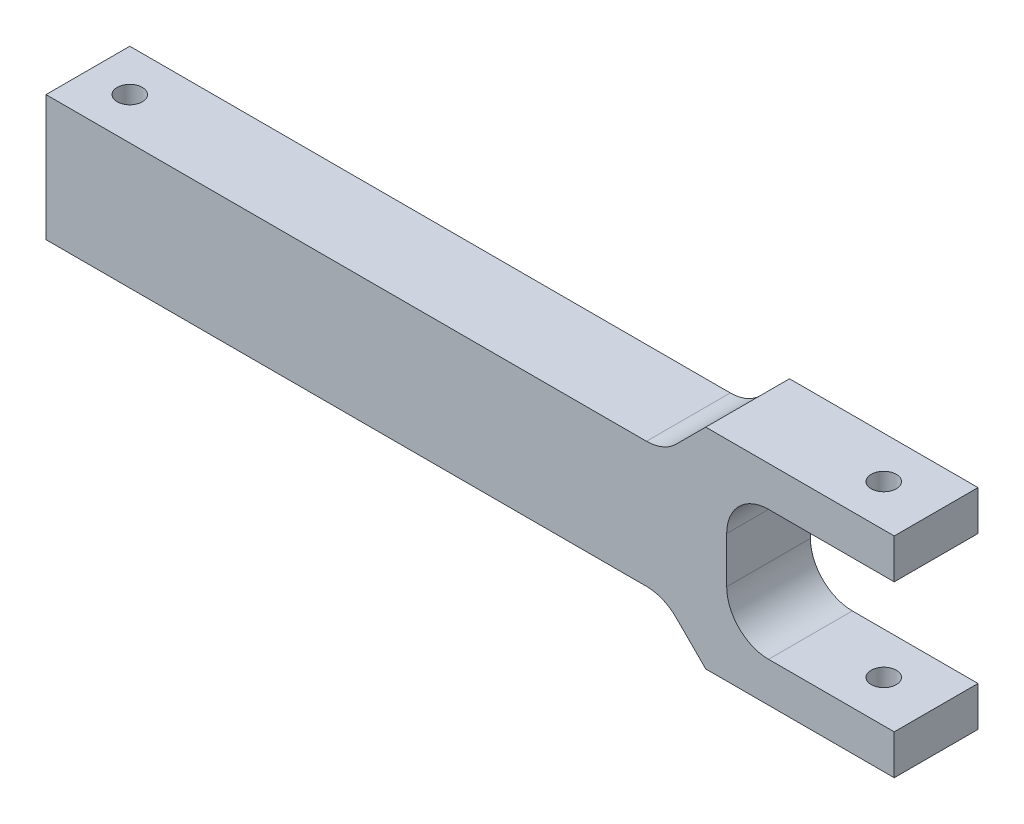
ISO-10303-21;
HEADER;
FILE_DESCRIPTION(('STEP AP214'),'2;1');
FILE_NAME('part.step','',(''),(''),'','','');
FILE_SCHEMA(('AUTOMOTIVE_DESIGN { 1 0 10303 214 1 1 1 1 }'));
ENDSEC;
DATA;
#1=APPLICATION_CONTEXT('core data for automotive mechanical design processes');
#2=APPLICATION_PROTOCOL_DEFINITION('international standard','automotive_design',2000,#1);
#3=PRODUCT_CONTEXT('',#1,'mechanical');
#4=PRODUCT('Part','Part','',(#3));
#5=PRODUCT_RELATED_PRODUCT_CATEGORY('part','',(#4));
#6=PRODUCT_DEFINITION_FORMATION('','',#4);
#7=PRODUCT_DEFINITION_CONTEXT('part definition',#1,'design');
#8=PRODUCT_DEFINITION('design','',#6,#7);
#9=PRODUCT_DEFINITION_SHAPE('','',#8);
#10=(LENGTH_UNIT() NAMED_UNIT(*) SI_UNIT(.MILLI.,.METRE.));
#11=(NAMED_UNIT(*) PLANE_ANGLE_UNIT() SI_UNIT($,.RADIAN.));
#12=(NAMED_UNIT(*) SI_UNIT($,.STERADIAN.) SOLID_ANGLE_UNIT());
#13=UNCERTAINTY_MEASURE_WITH_UNIT(LENGTH_MEASURE(1.E-05),#10,'distance_accuracy_value','');
#14=(GEOMETRIC_REPRESENTATION_CONTEXT(3) GLOBAL_UNCERTAINTY_ASSIGNED_CONTEXT((#13)) GLOBAL_UNIT_ASSIGNED_CONTEXT((#10,
#11,#12)) REPRESENTATION_CONTEXT('',''));
#15=CARTESIAN_POINT('',(0.,0.,0.));
#16=DIRECTION('',(0.,0.,1.));
#17=DIRECTION('',(1.,0.,0.));
#18=AXIS2_PLACEMENT_3D('',#15,#16,#17);
#19=CARTESIAN_POINT('',(101.25,50.,-10.));
#20=DIRECTION('',(-1.,0.,0.));
#21=DIRECTION('',(0.,0.,1.));
#22=AXIS2_PLACEMENT_3D('',#19,#20,#21);
#23=PLANE('',#22);
#24=DIRECTION('',(0.,-1.,0.));
#25=VECTOR('',#24,1.);
#26=CARTESIAN_POINT('',(101.25,50.,-10.));
#27=LINE('',#26,#25);
#28=CARTESIAN_POINT('',(101.25,9.5,-10.));
#29=VERTEX_POINT('',#28);
#30=CARTESIAN_POINT('',(101.25,0.,-10.));
#31=VERTEX_POINT('',#30);
#32=EDGE_CURVE('E182',#29,#31,#27,.T.);
#33=ORIENTED_EDGE('',*,*,#32,.F.);
#34=DIRECTION('',(0.,0.,1.));
#35=VECTOR('',#34,1.);
#36=CARTESIAN_POINT('',(101.25,9.5,-10.));
#37=LINE('',#36,#35);
#38=CARTESIAN_POINT('',(101.25,9.5,10.));
#39=VERTEX_POINT('',#38);
#40=EDGE_CURVE('E207',#29,#39,#37,.T.);
#41=ORIENTED_EDGE('',*,*,#40,.T.);
#42=DIRECTION('',(0.,-1.,0.));
#43=VECTOR('',#42,1.);
#44=CARTESIAN_POINT('',(101.25,50.,10.));
#45=LINE('',#44,#43);
#46=CARTESIAN_POINT('',(101.25,0.,10.));
#47=VERTEX_POINT('',#46);
#48=EDGE_CURVE('E185',#39,#47,#45,.T.);
#49=ORIENTED_EDGE('',*,*,#48,.T.);
#50=DIRECTION('',(0.,0.,-1.));
#51=VECTOR('',#50,1.);
#52=CARTESIAN_POINT('',(101.25,0.,-10.));
#53=LINE('',#52,#51);
#54=EDGE_CURVE('E293',#47,#31,#53,.T.);
#55=ORIENTED_EDGE('',*,*,#54,.T.);
#56=EDGE_LOOP('',(#33,#41,#49,#55));
#57=FACE_BOUND('',#56,.T.);
#58=ADVANCED_FACE('F46',(#57),#23,.F.);
#59=CARTESIAN_POINT('',(88.75,50.,0.));
#60=DIRECTION('',(0.,-1.,0.));
#61=DIRECTION('',(0.,0.,-1.));
#62=AXIS2_PLACEMENT_3D('',#59,#60,#61);
#63=CYLINDRICAL_SURFACE('',#62,3.00000000000001);
#64=CARTESIAN_POINT('',(88.75,9.5,0.));
#65=DIRECTION('',(0.,-1.,0.));
#66=DIRECTION('',(0.,0.,-1.));
#67=AXIS2_PLACEMENT_3D('',#64,#65,#66);
#68=CIRCLE('',#67,3.00000000000001);
#69=CARTESIAN_POINT('',(88.75,9.5,-3.00000000000001));
#70=VERTEX_POINT('',#69);
#71=EDGE_CURVE('E198',#70,#70,#68,.T.);
#72=ORIENTED_EDGE('',*,*,#71,.F.);
#73=EDGE_LOOP('',(#72));
#74=FACE_BOUND('',#73,.T.);
#75=CARTESIAN_POINT('',(88.75,0.,0.));
#76=DIRECTION('',(0.,1.,0.));
#77=DIRECTION('',(0.,0.,1.));
#78=AXIS2_PLACEMENT_3D('',#75,#76,#77);
#79=CIRCLE('',#78,3.00000000000001);
#80=CARTESIAN_POINT('',(88.75,0.,3.00000000000001));
#81=VERTEX_POINT('',#80);
#82=EDGE_CURVE('E289',#81,#81,#79,.T.);
#83=ORIENTED_EDGE('',*,*,#82,.F.);
#84=EDGE_LOOP('',(#83));
#85=FACE_BOUND('',#84,.T.);
#86=ADVANCED_FACE('F329',(#74,#85),#63,.F.);
#87=CARTESIAN_POINT('',(0.,50.,0.));
#88=DIRECTION('',(0.,1.,0.));
#89=DIRECTION('',(0.,0.,1.));
#90=AXIS2_PLACEMENT_3D('',#87,#88,#89);
#91=PLANE('',#90);
#92=DIRECTION('',(-1.,0.,0.));
#93=VECTOR('',#92,1.);
#94=CARTESIAN_POINT('',(-101.25,50.,-10.));
#95=LINE('',#94,#93);
#96=CARTESIAN_POINT('',(101.25,50.,-10.));
#97=VERTEX_POINT('',#96);
#98=CARTESIAN_POINT('',(56.25,50.,-10.));
#99=VERTEX_POINT('',#98);
#100=EDGE_CURVE('E299',#97,#99,#95,.T.);
#101=ORIENTED_EDGE('',*,*,#100,.T.);
#102=DIRECTION('',(0.,0.,1.));
#103=VECTOR('',#102,1.);
#104=CARTESIAN_POINT('',(56.25,50.,10.));
#105=LINE('',#104,#103);
#106=CARTESIAN_POINT('',(56.25,50.,10.));
#107=VERTEX_POINT('',#106);
#108=EDGE_CURVE('E222',#99,#107,#105,.T.);
#109=ORIENTED_EDGE('',*,*,#108,.T.);
#110=DIRECTION('',(1.,0.,0.));
#111=VECTOR('',#110,1.);
#112=CARTESIAN_POINT('',(-101.25,50.,10.));
#113=LINE('',#112,#111);
#114=CARTESIAN_POINT('',(101.25,50.,10.));
#115=VERTEX_POINT('',#114);
#116=EDGE_CURVE('E302',#107,#115,#113,.T.);
#117=ORIENTED_EDGE('',*,*,#116,.T.);
#118=DIRECTION('',(0.,0.,-1.));
#119=VECTOR('',#118,1.);
#120=CARTESIAN_POINT('',(101.25,50.,-10.));
#121=LINE('',#120,#119);
#122=EDGE_CURVE('E296',#115,#97,#121,.T.);
#123=ORIENTED_EDGE('',*,*,#122,.T.);
#124=EDGE_LOOP('',(#101,#109,#117,#123));
#125=FACE_BOUND('',#124,.T.);
#126=CARTESIAN_POINT('',(88.75,50.,0.));
#127=DIRECTION('',(0.,1.,0.));
#128=DIRECTION('',(0.,0.,1.));
#129=AXIS2_PLACEMENT_3D('',#126,#127,#128);
#130=CIRCLE('',#129,3.00000000000001);
#131=CARTESIAN_POINT('',(88.75,50.,3.00000000000001));
#132=VERTEX_POINT('',#131);
#133=EDGE_CURVE('E290',#132,#132,#130,.T.);
#134=ORIENTED_EDGE('',*,*,#133,.F.);
#135=EDGE_LOOP('',(#134));
#136=FACE_BOUND('',#135,.T.);
#137=ADVANCED_FACE('F335',(#125,#136),#91,.T.);
#138=CARTESIAN_POINT('',(0.,0.,0.));
#139=DIRECTION('',(0.,1.,0.));
#140=DIRECTION('',(0.,0.,1.));
#141=AXIS2_PLACEMENT_3D('',#138,#139,#140);
#142=PLANE('',#141);
#143=DIRECTION('',(1.,0.,0.));
#144=VECTOR('',#143,1.);
#145=CARTESIAN_POINT('',(-101.25,0.,10.));
#146=LINE('',#145,#144);
#147=CARTESIAN_POINT('',(56.25,0.,10.));
#148=VERTEX_POINT('',#147);
#149=EDGE_CURVE('E300',#148,#47,#146,.T.);
#150=ORIENTED_EDGE('',*,*,#149,.F.);
#151=DIRECTION('',(0.,0.,-1.));
#152=VECTOR('',#151,1.);
#153=CARTESIAN_POINT('',(56.25,0.,0.));
#154=LINE('',#153,#152);
#155=CARTESIAN_POINT('',(56.25,0.,-10.));
#156=VERTEX_POINT('',#155);
#157=EDGE_CURVE('E216',#148,#156,#154,.T.);
#158=ORIENTED_EDGE('',*,*,#157,.T.);
#159=DIRECTION('',(-1.,0.,0.));
#160=VECTOR('',#159,1.);
#161=CARTESIAN_POINT('',(-101.25,0.,-10.));
#162=LINE('',#161,#160);
#163=EDGE_CURVE('E306',#31,#156,#162,.T.);
#164=ORIENTED_EDGE('',*,*,#163,.F.);
#165=ORIENTED_EDGE('',*,*,#54,.F.);
#166=EDGE_LOOP('',(#150,#158,#164,#165));
#167=FACE_BOUND('',#166,.T.);
#168=ORIENTED_EDGE('',*,*,#82,.T.);
#169=EDGE_LOOP('',(#168));
#170=FACE_BOUND('',#169,.T.);
#171=ADVANCED_FACE('F318',(#167,#170),#142,.F.);
#172=CARTESIAN_POINT('',(101.25,40.5,10.));
#173=VERTEX_POINT('',#172);
#174=EDGE_CURVE('E180',#115,#173,#45,.T.);
#175=ORIENTED_EDGE('',*,*,#174,.T.);
#176=DIRECTION('',(0.,0.,-1.));
#177=VECTOR('',#176,1.);
#178=CARTESIAN_POINT('',(101.25,40.5,-10.));
#179=LINE('',#178,#177);
#180=CARTESIAN_POINT('',(101.25,40.5,-10.));
#181=VERTEX_POINT('',#180);
#182=EDGE_CURVE('E202',#173,#181,#179,.T.);
#183=ORIENTED_EDGE('',*,*,#182,.T.);
#184=EDGE_CURVE('E189',#97,#181,#27,.T.);
#185=ORIENTED_EDGE('',*,*,#184,.F.);
#186=ORIENTED_EDGE('',*,*,#122,.F.);
#187=EDGE_LOOP('',(#175,#183,#185,#186));
#188=FACE_BOUND('',#187,.T.);
#189=ADVANCED_FACE('F331',(#188),#23,.F.);
#190=CARTESIAN_POINT('',(-101.25,50.,-10.));
#191=DIRECTION('',(0.,0.,1.));
#192=DIRECTION('',(1.,0.,0.));
#193=AXIS2_PLACEMENT_3D('',#190,#191,#192);
#194=PLANE('',#193);
#195=ORIENTED_EDGE('',*,*,#163,.T.);
#196=DIRECTION('',(0.70710678118655,-0.707106781186546,0.));
#197=VECTOR('',#196,1.);
#198=CARTESIAN_POINT('',(46.25,9.99999999999998,-10.));
#199=LINE('',#198,#197);
#200=CARTESIAN_POINT('',(49.1789321881346,7.07106781186541,-10.));
#201=VERTEX_POINT('',#200);
#202=EDGE_CURVE('E220',#156,#201,#199,.F.);
#203=ORIENTED_EDGE('',*,*,#202,.T.);
#204=CARTESIAN_POINT('',(42.1078643762691,0.,-10.));
#205=DIRECTION('',(0.,0.,1.));
#206=DIRECTION('',(1.,0.,0.));
#207=AXIS2_PLACEMENT_3D('',#204,#205,#206);
#208=CIRCLE('',#207,10.);
#209=CARTESIAN_POINT('',(42.1078643762691,9.99999999999992,-10.));
#210=VERTEX_POINT('',#209);
#211=EDGE_CURVE('E13',#201,#210,#208,.T.);
#212=ORIENTED_EDGE('',*,*,#211,.T.);
#213=DIRECTION('',(-1.,0.,0.));
#214=VECTOR('',#213,1.);
#215=CARTESIAN_POINT('',(-101.25,10.,-10.));
#216=LINE('',#215,#214);
#217=CARTESIAN_POINT('',(-101.25,10.,-10.));
#218=VERTEX_POINT('',#217);
#219=EDGE_CURVE('E206',#210,#218,#216,.T.);
#220=ORIENTED_EDGE('',*,*,#219,.T.);
#221=DIRECTION('',(0.,-1.,0.));
#222=VECTOR('',#221,1.);
#223=CARTESIAN_POINT('',(-101.25,50.,-10.));
#224=LINE('',#223,#222);
#225=CARTESIAN_POINT('',(-101.25,40.,-10.));
#226=VERTEX_POINT('',#225);
#227=EDGE_CURVE('E174',#226,#218,#224,.T.);
#228=ORIENTED_EDGE('',*,*,#227,.F.);
#229=DIRECTION('',(1.,0.,0.));
#230=VECTOR('',#229,1.);
#231=CARTESIAN_POINT('',(-101.25,40.,-10.));
#232=LINE('',#231,#230);
#233=CARTESIAN_POINT('',(42.1078643762691,40.0000000000001,-10.));
#234=VERTEX_POINT('',#233);
#235=EDGE_CURVE('E211',#226,#234,#232,.T.);
#236=ORIENTED_EDGE('',*,*,#235,.T.);
#237=CARTESIAN_POINT('',(42.1078643762691,50.0000000000001,-10.));
#238=DIRECTION('',(0.,0.,1.));
#239=DIRECTION('',(1.,0.,0.));
#240=AXIS2_PLACEMENT_3D('',#237,#238,#239);
#241=CIRCLE('',#240,10.);
#242=CARTESIAN_POINT('',(49.1789321881346,42.9289321881346,-10.));
#243=VERTEX_POINT('',#242);
#244=EDGE_CURVE('E252',#234,#243,#241,.T.);
#245=ORIENTED_EDGE('',*,*,#244,.T.);
#246=DIRECTION('',(0.707106781186546,0.70710678118655,0.));
#247=VECTOR('',#246,1.);
#248=CARTESIAN_POINT('',(56.25,50.,-10.));
#249=LINE('',#248,#247);
#250=EDGE_CURVE('E218',#243,#99,#249,.T.);
#251=ORIENTED_EDGE('',*,*,#250,.T.);
#252=ORIENTED_EDGE('',*,*,#100,.F.);
#253=ORIENTED_EDGE('',*,*,#184,.T.);
#254=DIRECTION('',(-1.,0.,0.));
#255=VECTOR('',#254,1.);
#256=CARTESIAN_POINT('',(-101.25,40.5,-10.));
#257=LINE('',#256,#255);
#258=CARTESIAN_POINT('',(71.25,40.5,-10.));
#259=VERTEX_POINT('',#258);
#260=EDGE_CURVE('E196',#181,#259,#257,.T.);
#261=ORIENTED_EDGE('',*,*,#260,.T.);
#262=CARTESIAN_POINT('',(71.25,30.5,-10.));
#263=DIRECTION('',(0.,0.,1.));
#264=DIRECTION('',(1.,0.,0.));
#265=AXIS2_PLACEMENT_3D('',#262,#263,#264);
#266=CIRCLE('',#265,10.);
#267=CARTESIAN_POINT('',(61.25,30.5,-10.));
#268=VERTEX_POINT('',#267);
#269=EDGE_CURVE('E237',#259,#268,#266,.T.);
#270=ORIENTED_EDGE('',*,*,#269,.T.);
#271=DIRECTION('',(0.,-1.,0.));
#272=VECTOR('',#271,1.);
#273=CARTESIAN_POINT('',(61.25,50.,-10.));
#274=LINE('',#273,#272);
#275=CARTESIAN_POINT('',(61.25,19.5,-10.));
#276=VERTEX_POINT('',#275);
#277=EDGE_CURVE('E286',#268,#276,#274,.T.);
#278=ORIENTED_EDGE('',*,*,#277,.T.);
#279=CARTESIAN_POINT('',(71.25,19.5,-10.));
#280=DIRECTION('',(0.,0.,1.));
#281=DIRECTION('',(1.,0.,0.));
#282=AXIS2_PLACEMENT_3D('',#279,#280,#281);
#283=CIRCLE('',#282,10.);
#284=CARTESIAN_POINT('',(71.25,9.5,-10.));
#285=VERTEX_POINT('',#284);
#286=EDGE_CURVE('E241',#276,#285,#283,.T.);
#287=ORIENTED_EDGE('',*,*,#286,.T.);
#288=DIRECTION('',(1.,0.,0.));
#289=VECTOR('',#288,1.);
#290=CARTESIAN_POINT('',(-101.25,9.5,-10.));
#291=LINE('',#290,#289);
#292=EDGE_CURVE('E201',#285,#29,#291,.T.);
#293=ORIENTED_EDGE('',*,*,#292,.T.);
#294=ORIENTED_EDGE('',*,*,#32,.T.);
#295=EDGE_LOOP('',(#195,#203,#212,#220,#228,#236,#245,#251,#252,#253,#261,#270,#278,#287,#293,#294));
#296=FACE_BOUND('',#295,.T.);
#297=ADVANCED_FACE('F258',(#296),#194,.F.);
#298=CARTESIAN_POINT('',(-101.25,50.,-10.));
#299=DIRECTION('',(1.,0.,0.));
#300=DIRECTION('',(0.,0.,-1.));
#301=AXIS2_PLACEMENT_3D('',#298,#299,#300);
#302=PLANE('',#301);
#303=DIRECTION('',(0.,-1.,0.));
#304=VECTOR('',#303,1.);
#305=CARTESIAN_POINT('',(-101.25,50.,10.));
#306=LINE('',#305,#304);
#307=CARTESIAN_POINT('',(-101.25,40.,10.));
#308=VERTEX_POINT('',#307);
#309=CARTESIAN_POINT('',(-101.25,10.,10.));
#310=VERTEX_POINT('',#309);
#311=EDGE_CURVE('E172',#308,#310,#306,.T.);
#312=ORIENTED_EDGE('',*,*,#311,.F.);
#313=DIRECTION('',(0.,0.,1.));
#314=VECTOR('',#313,1.);
#315=CARTESIAN_POINT('',(-101.25,40.,-15.));
#316=LINE('',#315,#314);
#317=EDGE_CURVE('E270',#226,#308,#316,.T.);
#318=ORIENTED_EDGE('',*,*,#317,.F.);
#319=ORIENTED_EDGE('',*,*,#227,.T.);
#320=DIRECTION('',(0.,0.,1.));
#321=VECTOR('',#320,1.);
#322=CARTESIAN_POINT('',(-101.25,10.,-15.));
#323=LINE('',#322,#321);
#324=EDGE_CURVE('E162',#218,#310,#323,.T.);
#325=ORIENTED_EDGE('',*,*,#324,.T.);
#326=EDGE_LOOP('',(#312,#318,#319,#325));
#327=FACE_BOUND('',#326,.T.);
#328=ADVANCED_FACE('F170',(#327),#302,.F.);
#329=CARTESIAN_POINT('',(-101.25,50.,10.));
#330=DIRECTION('',(0.,0.,-1.));
#331=DIRECTION('',(-1.,0.,0.));
#332=AXIS2_PLACEMENT_3D('',#329,#330,#331);
#333=PLANE('',#332);
#334=DIRECTION('',(-1.,0.,0.));
#335=VECTOR('',#334,1.);
#336=CARTESIAN_POINT('',(-101.25,10.,10.));
#337=LINE('',#336,#335);
#338=CARTESIAN_POINT('',(42.1078643762691,9.99999999999992,10.));
#339=VERTEX_POINT('',#338);
#340=EDGE_CURVE('E158',#339,#310,#337,.T.);
#341=ORIENTED_EDGE('',*,*,#340,.F.);
#342=CARTESIAN_POINT('',(42.1078643762691,0.,10.));
#343=DIRECTION('',(0.,0.,-1.));
#344=DIRECTION('',(-1.,0.,0.));
#345=AXIS2_PLACEMENT_3D('',#342,#343,#344);
#346=CIRCLE('',#345,10.);
#347=CARTESIAN_POINT('',(49.1789321881346,7.07106781186541,10.));
#348=VERTEX_POINT('',#347);
#349=EDGE_CURVE('E54',#339,#348,#346,.T.);
#350=ORIENTED_EDGE('',*,*,#349,.T.);
#351=DIRECTION('',(-0.70710678118655,0.707106781186546,0.));
#352=VECTOR('',#351,1.);
#353=CARTESIAN_POINT('',(46.25,9.99999999999998,10.));
#354=LINE('',#353,#352);
#355=EDGE_CURVE('E214',#348,#148,#354,.F.);
#356=ORIENTED_EDGE('',*,*,#355,.T.);
#357=ORIENTED_EDGE('',*,*,#149,.T.);
#358=ORIENTED_EDGE('',*,*,#48,.F.);
#359=DIRECTION('',(1.,0.,0.));
#360=VECTOR('',#359,1.);
#361=CARTESIAN_POINT('',(61.25,9.5,10.));
#362=LINE('',#361,#360);
#363=CARTESIAN_POINT('',(71.25,9.5,10.));
#364=VERTEX_POINT('',#363);
#365=EDGE_CURVE('E197',#364,#39,#362,.T.);
#366=ORIENTED_EDGE('',*,*,#365,.F.);
#367=CARTESIAN_POINT('',(71.25,19.5,10.));
#368=DIRECTION('',(0.,0.,-1.));
#369=DIRECTION('',(-1.,0.,0.));
#370=AXIS2_PLACEMENT_3D('',#367,#368,#369);
#371=CIRCLE('',#370,10.);
#372=CARTESIAN_POINT('',(61.25,19.5,10.));
#373=VERTEX_POINT('',#372);
#374=EDGE_CURVE('E239',#364,#373,#371,.T.);
#375=ORIENTED_EDGE('',*,*,#374,.T.);
#376=DIRECTION('',(0.,-1.,0.));
#377=VECTOR('',#376,1.);
#378=CARTESIAN_POINT('',(61.25,40.5,10.));
#379=LINE('',#378,#377);
#380=CARTESIAN_POINT('',(61.25,30.5,10.));
#381=VERTEX_POINT('',#380);
#382=EDGE_CURVE('E356',#381,#373,#379,.T.);
#383=ORIENTED_EDGE('',*,*,#382,.F.);
#384=CARTESIAN_POINT('',(71.25,30.5,10.));
#385=DIRECTION('',(0.,0.,-1.));
#386=DIRECTION('',(-1.,0.,0.));
#387=AXIS2_PLACEMENT_3D('',#384,#385,#386);
#388=CIRCLE('',#387,10.);
#389=CARTESIAN_POINT('',(71.25,40.5,10.));
#390=VERTEX_POINT('',#389);
#391=EDGE_CURVE('E235',#381,#390,#388,.T.);
#392=ORIENTED_EDGE('',*,*,#391,.T.);
#393=DIRECTION('',(-1.,0.,0.));
#394=VECTOR('',#393,1.);
#395=CARTESIAN_POINT('',(61.25,40.5,10.));
#396=LINE('',#395,#394);
#397=EDGE_CURVE('E272',#173,#390,#396,.T.);
#398=ORIENTED_EDGE('',*,*,#397,.F.);
#399=ORIENTED_EDGE('',*,*,#174,.F.);
#400=ORIENTED_EDGE('',*,*,#116,.F.);
#401=DIRECTION('',(-0.707106781186546,-0.70710678118655,0.));
#402=VECTOR('',#401,1.);
#403=CARTESIAN_POINT('',(56.25,50.,10.));
#404=LINE('',#403,#402);
#405=CARTESIAN_POINT('',(49.1789321881346,42.9289321881346,10.));
#406=VERTEX_POINT('',#405);
#407=EDGE_CURVE('E192',#107,#406,#404,.T.);
#408=ORIENTED_EDGE('',*,*,#407,.T.);
#409=CARTESIAN_POINT('',(42.1078643762691,50.0000000000001,10.));
#410=DIRECTION('',(0.,0.,-1.));
#411=DIRECTION('',(-1.,0.,0.));
#412=AXIS2_PLACEMENT_3D('',#409,#410,#411);
#413=CIRCLE('',#412,10.);
#414=CARTESIAN_POINT('',(42.1078643762691,40.0000000000001,10.));
#415=VERTEX_POINT('',#414);
#416=EDGE_CURVE('E250',#406,#415,#413,.T.);
#417=ORIENTED_EDGE('',*,*,#416,.T.);
#418=DIRECTION('',(1.,0.,0.));
#419=VECTOR('',#418,1.);
#420=CARTESIAN_POINT('',(-101.25,40.,10.));
#421=LINE('',#420,#419);
#422=EDGE_CURVE('E175',#308,#415,#421,.T.);
#423=ORIENTED_EDGE('',*,*,#422,.F.);
#424=ORIENTED_EDGE('',*,*,#311,.T.);
#425=EDGE_LOOP('',(#341,#350,#356,#357,#358,#366,#375,#383,#392,#398,#399,#400,#408,#417,#423,#424));
#426=FACE_BOUND('',#425,.T.);
#427=ADVANCED_FACE('F178',(#426),#333,.F.);
#428=CARTESIAN_POINT('',(88.75,40.5,0.));
#429=DIRECTION('',(0.,1.,0.));
#430=DIRECTION('',(0.,0.,1.));
#431=AXIS2_PLACEMENT_3D('',#428,#429,#430);
#432=CIRCLE('',#431,3.00000000000001);
#433=CARTESIAN_POINT('',(88.75,40.5,3.00000000000001));
#434=VERTEX_POINT('',#433);
#435=EDGE_CURVE('E193',#434,#434,#432,.T.);
#436=ORIENTED_EDGE('',*,*,#435,.F.);
#437=EDGE_LOOP('',(#436));
#438=FACE_BOUND('',#437,.T.);
#439=ORIENTED_EDGE('',*,*,#133,.T.);
#440=EDGE_LOOP('',(#439));
#441=FACE_BOUND('',#440,.T.);
#442=ADVANCED_FACE('F338',(#438,#441),#63,.F.);
#443=CARTESIAN_POINT('',(61.25,40.5,-15.));
#444=DIRECTION('',(-1.,0.,0.));
#445=DIRECTION('',(0.,0.,1.));
#446=AXIS2_PLACEMENT_3D('',#443,#444,#445);
#447=PLANE('',#446);
#448=ORIENTED_EDGE('',*,*,#277,.F.);
#449=DIRECTION('',(0.,0.,1.));
#450=VECTOR('',#449,1.);
#451=CARTESIAN_POINT('',(61.25,30.5,10.));
#452=LINE('',#451,#450);
#453=EDGE_CURVE('E227',#268,#381,#452,.T.);
#454=ORIENTED_EDGE('',*,*,#453,.T.);
#455=ORIENTED_EDGE('',*,*,#382,.T.);
#456=DIRECTION('',(0.,0.,1.));
#457=VECTOR('',#456,1.);
#458=CARTESIAN_POINT('',(61.25,19.5,-10.));
#459=LINE('',#458,#457);
#460=EDGE_CURVE('E225',#373,#276,#459,.F.);
#461=ORIENTED_EDGE('',*,*,#460,.T.);
#462=EDGE_LOOP('',(#448,#454,#455,#461));
#463=FACE_BOUND('',#462,.T.);
#464=ADVANCED_FACE('F368',(#463),#447,.F.);
#465=CARTESIAN_POINT('',(61.25,9.5,-15.));
#466=DIRECTION('',(0.,-1.,0.));
#467=DIRECTION('',(0.,0.,-1.));
#468=AXIS2_PLACEMENT_3D('',#465,#466,#467);
#469=PLANE('',#468);
#470=ORIENTED_EDGE('',*,*,#71,.T.);
#471=EDGE_LOOP('',(#470));
#472=FACE_BOUND('',#471,.T.);
#473=ORIENTED_EDGE('',*,*,#292,.F.);
#474=DIRECTION('',(0.,0.,1.));
#475=VECTOR('',#474,1.);
#476=CARTESIAN_POINT('',(71.25,9.5,10.));
#477=LINE('',#476,#475);
#478=EDGE_CURVE('E232',#285,#364,#477,.T.);
#479=ORIENTED_EDGE('',*,*,#478,.T.);
#480=ORIENTED_EDGE('',*,*,#365,.T.);
#481=ORIENTED_EDGE('',*,*,#40,.F.);
#482=EDGE_LOOP('',(#473,#479,#480,#481));
#483=FACE_BOUND('',#482,.T.);
#484=ADVANCED_FACE('F363',(#472,#483),#469,.F.);
#485=CARTESIAN_POINT('',(61.25,40.5,-15.));
#486=DIRECTION('',(0.,1.,0.));
#487=DIRECTION('',(0.,0.,1.));
#488=AXIS2_PLACEMENT_3D('',#485,#486,#487);
#489=PLANE('',#488);
#490=ORIENTED_EDGE('',*,*,#435,.T.);
#491=EDGE_LOOP('',(#490));
#492=FACE_BOUND('',#491,.T.);
#493=ORIENTED_EDGE('',*,*,#397,.T.);
#494=DIRECTION('',(0.,0.,1.));
#495=VECTOR('',#494,1.);
#496=CARTESIAN_POINT('',(71.25,40.5,-10.));
#497=LINE('',#496,#495);
#498=EDGE_CURVE('E230',#390,#259,#497,.F.);
#499=ORIENTED_EDGE('',*,*,#498,.T.);
#500=ORIENTED_EDGE('',*,*,#260,.F.);
#501=ORIENTED_EDGE('',*,*,#182,.F.);
#502=EDGE_LOOP('',(#493,#499,#500,#501));
#503=FACE_BOUND('',#502,.T.);
#504=ADVANCED_FACE('F373',(#492,#503),#489,.F.);
#505=CARTESIAN_POINT('',(-101.25,10.,-15.));
#506=DIRECTION('',(0.,1.,0.));
#507=DIRECTION('',(-1.,0.,0.));
#508=AXIS2_PLACEMENT_3D('',#505,#506,#507);
#509=PLANE('',#508);
#510=CARTESIAN_POINT('',(-91.25,10.,0.));
#511=DIRECTION('',(0.,1.,0.));
#512=DIRECTION('',(-1.,0.,0.));
#513=AXIS2_PLACEMENT_3D('',#510,#511,#512);
#514=CIRCLE('',#513,3.00000000000001);
#515=CARTESIAN_POINT('',(-94.25,10.,0.));
#516=VERTEX_POINT('',#515);
#517=EDGE_CURVE('E203',#516,#516,#514,.T.);
#518=ORIENTED_EDGE('',*,*,#517,.T.);
#519=EDGE_LOOP('',(#518));
#520=FACE_BOUND('',#519,.T.);
#521=ORIENTED_EDGE('',*,*,#219,.F.);
#522=DIRECTION('',(0.,0.,-1.));
#523=VECTOR('',#522,1.);
#524=CARTESIAN_POINT('',(42.1078643762691,9.99999999999992,-15.));
#525=LINE('',#524,#523);
#526=EDGE_CURVE('E165',#210,#339,#525,.F.);
#527=ORIENTED_EDGE('',*,*,#526,.T.);
#528=ORIENTED_EDGE('',*,*,#340,.T.);
#529=ORIENTED_EDGE('',*,*,#324,.F.);
#530=EDGE_LOOP('',(#521,#527,#528,#529));
#531=FACE_BOUND('',#530,.T.);
#532=ADVANCED_FACE('F161',(#520,#531),#509,.F.);
#533=CARTESIAN_POINT('',(-101.25,40.,-15.));
#534=DIRECTION('',(0.,-1.,0.));
#535=DIRECTION('',(1.,0.,0.));
#536=AXIS2_PLACEMENT_3D('',#533,#534,#535);
#537=PLANE('',#536);
#538=CARTESIAN_POINT('',(-91.25,40.,0.));
#539=DIRECTION('',(0.,-1.,0.));
#540=DIRECTION('',(1.,0.,0.));
#541=AXIS2_PLACEMENT_3D('',#538,#539,#540);
#542=CIRCLE('',#541,3.00000000000001);
#543=CARTESIAN_POINT('',(-88.25,40.,0.));
#544=VERTEX_POINT('',#543);
#545=EDGE_CURVE('E208',#544,#544,#542,.T.);
#546=ORIENTED_EDGE('',*,*,#545,.T.);
#547=EDGE_LOOP('',(#546));
#548=FACE_BOUND('',#547,.T.);
#549=ORIENTED_EDGE('',*,*,#422,.T.);
#550=DIRECTION('',(0.,0.,1.));
#551=VECTOR('',#550,1.);
#552=CARTESIAN_POINT('',(42.1078643762691,40.0000000000001,-15.));
#553=LINE('',#552,#551);
#554=EDGE_CURVE('E246',#415,#234,#553,.F.);
#555=ORIENTED_EDGE('',*,*,#554,.T.);
#556=ORIENTED_EDGE('',*,*,#235,.F.);
#557=ORIENTED_EDGE('',*,*,#317,.T.);
#558=EDGE_LOOP('',(#549,#555,#556,#557));
#559=FACE_BOUND('',#558,.T.);
#560=ADVANCED_FACE('F269',(#548,#559),#537,.F.);
#561=CARTESIAN_POINT('',(-91.25,50.,0.));
#562=DIRECTION('',(0.,-1.,0.));
#563=DIRECTION('',(0.,0.,-1.));
#564=AXIS2_PLACEMENT_3D('',#561,#562,#563);
#565=CYLINDRICAL_SURFACE('',#564,3.00000000000001);
#566=ORIENTED_EDGE('',*,*,#545,.F.);
#567=EDGE_LOOP('',(#566));
#568=FACE_BOUND('',#567,.T.);
#569=ORIENTED_EDGE('',*,*,#517,.F.);
#570=EDGE_LOOP('',(#569));
#571=FACE_BOUND('',#570,.T.);
#572=ADVANCED_FACE('F388',(#568,#571),#565,.F.);
#573=CARTESIAN_POINT('',(46.25,9.99999999999998,-15.));
#574=DIRECTION('',(0.707106781186545,0.707106781186549,0.));
#575=DIRECTION('',(0.,0.,1.));
#576=AXIS2_PLACEMENT_3D('',#573,#574,#575);
#577=PLANE('',#576);
#578=ORIENTED_EDGE('',*,*,#355,.F.);
#579=DIRECTION('',(0.,0.,1.));
#580=VECTOR('',#579,1.);
#581=CARTESIAN_POINT('',(49.1789321881346,7.07106781186541,-15.));
#582=LINE('',#581,#580);
#583=EDGE_CURVE('E67',#348,#201,#582,.F.);
#584=ORIENTED_EDGE('',*,*,#583,.T.);
#585=ORIENTED_EDGE('',*,*,#202,.F.);
#586=ORIENTED_EDGE('',*,*,#157,.F.);
#587=EDGE_LOOP('',(#578,#584,#585,#586));
#588=FACE_BOUND('',#587,.T.);
#589=ADVANCED_FACE('F321',(#588),#577,.F.);
#590=CARTESIAN_POINT('',(56.25,50.,0.));
#591=DIRECTION('',(-0.707106781186549,0.707106781186545,0.));
#592=DIRECTION('',(0.,0.,-1.));
#593=AXIS2_PLACEMENT_3D('',#590,#591,#592);
#594=PLANE('',#593);
#595=ORIENTED_EDGE('',*,*,#250,.F.);
#596=DIRECTION('',(0.,0.,1.));
#597=VECTOR('',#596,1.);
#598=CARTESIAN_POINT('',(49.1789321881346,42.9289321881346,0.));
#599=LINE('',#598,#597);
#600=EDGE_CURVE('E243',#243,#406,#599,.T.);
#601=ORIENTED_EDGE('',*,*,#600,.T.);
#602=ORIENTED_EDGE('',*,*,#407,.F.);
#603=ORIENTED_EDGE('',*,*,#108,.F.);
#604=EDGE_LOOP('',(#595,#601,#602,#603));
#605=FACE_BOUND('',#604,.T.);
#606=ADVANCED_FACE('F265',(#605),#594,.T.);
#607=CARTESIAN_POINT('',(71.25,30.5,-15.));
#608=DIRECTION('',(0.,0.,-1.));
#609=DIRECTION('',(-1.,0.,0.));
#610=AXIS2_PLACEMENT_3D('',#607,#608,#609);
#611=CYLINDRICAL_SURFACE('',#610,10.);
#612=ORIENTED_EDGE('',*,*,#269,.F.);
#613=ORIENTED_EDGE('',*,*,#498,.F.);
#614=ORIENTED_EDGE('',*,*,#391,.F.);
#615=ORIENTED_EDGE('',*,*,#453,.F.);
#616=EDGE_LOOP('',(#612,#613,#614,#615));
#617=FACE_BOUND('',#616,.T.);
#618=ADVANCED_FACE('F372',(#617),#611,.F.);
#619=CARTESIAN_POINT('',(71.25,19.5,-15.));
#620=DIRECTION('',(0.,0.,-1.));
#621=DIRECTION('',(-1.,0.,0.));
#622=AXIS2_PLACEMENT_3D('',#619,#620,#621);
#623=CYLINDRICAL_SURFACE('',#622,10.);
#624=ORIENTED_EDGE('',*,*,#286,.F.);
#625=ORIENTED_EDGE('',*,*,#460,.F.);
#626=ORIENTED_EDGE('',*,*,#374,.F.);
#627=ORIENTED_EDGE('',*,*,#478,.F.);
#628=EDGE_LOOP('',(#624,#625,#626,#627));
#629=FACE_BOUND('',#628,.T.);
#630=ADVANCED_FACE('F327',(#629),#623,.F.);
#631=CARTESIAN_POINT('',(42.1078643762691,50.0000000000001,0.));
#632=DIRECTION('',(0.,0.,1.));
#633=DIRECTION('',(1.,0.,0.));
#634=AXIS2_PLACEMENT_3D('',#631,#632,#633);
#635=CYLINDRICAL_SURFACE('',#634,10.);
#636=ORIENTED_EDGE('',*,*,#244,.F.);
#637=ORIENTED_EDGE('',*,*,#554,.F.);
#638=ORIENTED_EDGE('',*,*,#416,.F.);
#639=ORIENTED_EDGE('',*,*,#600,.F.);
#640=EDGE_LOOP('',(#636,#637,#638,#639));
#641=FACE_BOUND('',#640,.T.);
#642=ADVANCED_FACE('F266',(#641),#635,.F.);
#643=CARTESIAN_POINT('',(42.1078643762691,0.,-15.));
#644=DIRECTION('',(0.,0.,-1.));
#645=DIRECTION('',(-1.,0.,0.));
#646=AXIS2_PLACEMENT_3D('',#643,#644,#645);
#647=CYLINDRICAL_SURFACE('',#646,10.);
#648=ORIENTED_EDGE('',*,*,#211,.F.);
#649=ORIENTED_EDGE('',*,*,#583,.F.);
#650=ORIENTED_EDGE('',*,*,#349,.F.);
#651=ORIENTED_EDGE('',*,*,#526,.F.);
#652=EDGE_LOOP('',(#648,#649,#650,#651));
#653=FACE_BOUND('',#652,.T.);
#654=ADVANCED_FACE('F48',(#653),#647,.F.);
#655=CLOSED_SHELL('',(#58,#86,#137,#171,#189,#297,#328,#427,#442,#464,#484,#504,#532,#560,#572,
#589,#606,#618,#630,#642,#654));
#656=MANIFOLD_SOLID_BREP('B2',#655);
#657=ADVANCED_BREP_SHAPE_REPRESENTATION('',(#18,#656),#14);
#658=SHAPE_DEFINITION_REPRESENTATION(#9,#657);
ENDSEC;
END-ISO-10303-21;
